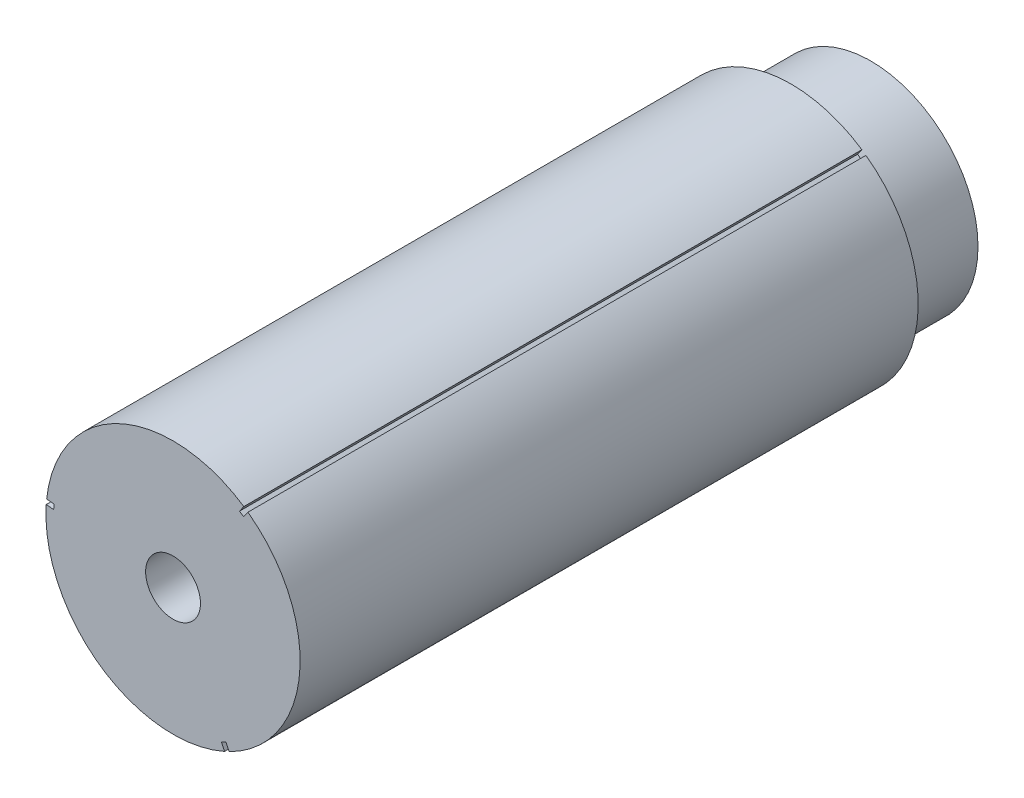
ISO-10303-21;
HEADER;
FILE_DESCRIPTION(('STEP AP214'),'2;1');
FILE_NAME('part.step','',(''),(''),'','','');
FILE_SCHEMA(('AUTOMOTIVE_DESIGN { 1 0 10303 214 1 1 1 1 }'));
ENDSEC;
DATA;
#1=APPLICATION_CONTEXT('core data for automotive mechanical design processes');
#2=APPLICATION_PROTOCOL_DEFINITION('international standard','automotive_design',2000,#1);
#3=PRODUCT_CONTEXT('',#1,'mechanical');
#4=PRODUCT('Part','Part','',(#3));
#5=PRODUCT_RELATED_PRODUCT_CATEGORY('part','',(#4));
#6=PRODUCT_DEFINITION_FORMATION('','',#4);
#7=PRODUCT_DEFINITION_CONTEXT('part definition',#1,'design');
#8=PRODUCT_DEFINITION('design','',#6,#7);
#9=PRODUCT_DEFINITION_SHAPE('','',#8);
#10=(LENGTH_UNIT() NAMED_UNIT(*) SI_UNIT(.MILLI.,.METRE.));
#11=(NAMED_UNIT(*) PLANE_ANGLE_UNIT() SI_UNIT($,.RADIAN.));
#12=(NAMED_UNIT(*) SI_UNIT($,.STERADIAN.) SOLID_ANGLE_UNIT());
#13=UNCERTAINTY_MEASURE_WITH_UNIT(LENGTH_MEASURE(1.E-05),#10,'distance_accuracy_value','');
#14=(GEOMETRIC_REPRESENTATION_CONTEXT(3) GLOBAL_UNCERTAINTY_ASSIGNED_CONTEXT((#13)) GLOBAL_UNIT_ASSIGNED_CONTEXT((#10,
#11,#12)) REPRESENTATION_CONTEXT('',''));
#15=CARTESIAN_POINT('',(0.,0.,0.));
#16=DIRECTION('',(0.,0.,1.));
#17=DIRECTION('',(1.,0.,0.));
#18=AXIS2_PLACEMENT_3D('',#15,#16,#17);
#19=CARTESIAN_POINT('',(0.,0.,70.));
#20=DIRECTION('',(0.,0.,-1.));
#21=DIRECTION('',(-1.,0.,0.));
#22=AXIS2_PLACEMENT_3D('',#19,#20,#21);
#23=CYLINDRICAL_SURFACE('',#22,12.75);
#24=CARTESIAN_POINT('',(0.,0.,8.));
#25=DIRECTION('',(0.,0.,1.));
#26=DIRECTION('',(1.,0.,0.));
#27=AXIS2_PLACEMENT_3D('',#24,#25,#26);
#28=CIRCLE('',#27,12.75);
#29=CARTESIAN_POINT('',(7.10084197030709,10.5896432098879,8.));
#30=VERTEX_POINT('',#29);
#31=CARTESIAN_POINT('',(-12.6780284226737,1.35281015441083,8.));
#32=VERTEX_POINT('',#31);
#33=EDGE_CURVE('E147',#30,#32,#28,.T.);
#34=ORIENTED_EDGE('',*,*,#33,.T.);
#35=DIRECTION('',(0.,0.,-1.));
#36=VECTOR('',#35,1.);
#37=CARTESIAN_POINT('',(-12.6780284226737,1.35281015441083,70.));
#38=LINE('',#37,#36);
#39=CARTESIAN_POINT('',(-12.6780284226737,1.35281015441083,70.));
#40=VERTEX_POINT('',#39);
#41=EDGE_CURVE('E131',#40,#32,#38,.T.);
#42=ORIENTED_EDGE('',*,*,#41,.F.);
#43=CARTESIAN_POINT('',(0.,0.,70.));
#44=DIRECTION('',(0.,0.,1.));
#45=DIRECTION('',(1.,0.,0.));
#46=AXIS2_PLACEMENT_3D('',#43,#44,#45);
#47=CIRCLE('',#46,12.75);
#48=CARTESIAN_POINT('',(7.10084197030709,10.5896432098879,70.));
#49=VERTEX_POINT('',#48);
#50=EDGE_CURVE('E145',#49,#40,#47,.T.);
#51=ORIENTED_EDGE('',*,*,#50,.F.);
#52=DIRECTION('',(0.,0.,-1.));
#53=VECTOR('',#52,1.);
#54=CARTESIAN_POINT('',(7.10084197030709,10.5896432098879,70.));
#55=LINE('',#54,#53);
#56=EDGE_CURVE('E199',#30,#49,#55,.F.);
#57=ORIENTED_EDGE('',*,*,#56,.F.);
#58=EDGE_LOOP('',(#34,#42,#51,#57));
#59=FACE_BOUND('',#58,.T.);
#60=ADVANCED_FACE('F38',(#59),#23,.T.);
#61=CARTESIAN_POINT('',(-12.7213210219299,0.854687929600842,70.));
#62=VERTEX_POINT('',#61);
#63=CARTESIAN_POINT('',(5.16744625111959,-11.655899761142,70.));
#64=VERTEX_POINT('',#63);
#65=EDGE_CURVE('E157',#62,#64,#47,.T.);
#66=ORIENTED_EDGE('',*,*,#65,.F.);
#67=DIRECTION('',(0.,0.,-1.));
#68=VECTOR('',#67,1.);
#69=CARTESIAN_POINT('',(-12.7213210219299,0.854687929600842,70.));
#70=LINE('',#69,#68);
#71=CARTESIAN_POINT('',(-12.7213210219299,0.854687929600842,8.));
#72=VERTEX_POINT('',#71);
#73=EDGE_CURVE('E53',#72,#62,#70,.F.);
#74=ORIENTED_EDGE('',*,*,#73,.F.);
#75=CARTESIAN_POINT('',(5.16744625111959,-11.655899761142,8.));
#76=VERTEX_POINT('',#75);
#77=EDGE_CURVE('E168',#72,#76,#28,.T.);
#78=ORIENTED_EDGE('',*,*,#77,.T.);
#79=DIRECTION('',(0.,0.,-1.));
#80=VECTOR('',#79,1.);
#81=CARTESIAN_POINT('',(5.16744625111959,-11.655899761142,70.));
#82=LINE('',#81,#80);
#83=EDGE_CURVE('E221',#64,#76,#82,.T.);
#84=ORIENTED_EDGE('',*,*,#83,.F.);
#85=EDGE_LOOP('',(#66,#74,#78,#84));
#86=FACE_BOUND('',#85,.T.);
#87=ADVANCED_FACE('F249',(#86),#23,.T.);
#88=CARTESIAN_POINT('',(0.,0.,0.));
#89=DIRECTION('',(0.,0.,1.));
#90=DIRECTION('',(1.,0.,0.));
#91=AXIS2_PLACEMENT_3D('',#88,#89,#90);
#92=PLANE('',#91);
#93=CARTESIAN_POINT('',(0.,0.,0.));
#94=DIRECTION('',(0.,0.,1.));
#95=DIRECTION('',(1.,0.,0.));
#96=AXIS2_PLACEMENT_3D('',#93,#94,#95);
#97=CIRCLE('',#96,10.75);
#98=CARTESIAN_POINT('',(10.75,0.,0.));
#99=VERTEX_POINT('',#98);
#100=EDGE_CURVE('E42',#99,#99,#97,.T.);
#101=ORIENTED_EDGE('',*,*,#100,.F.);
#102=EDGE_LOOP('',(#101));
#103=FACE_BOUND('',#102,.T.);
#104=CARTESIAN_POINT('',(0.,0.,0.));
#105=DIRECTION('',(0.,0.,1.));
#106=DIRECTION('',(1.,0.,0.));
#107=AXIS2_PLACEMENT_3D('',#104,#105,#106);
#108=CIRCLE('',#107,2.75);
#109=CARTESIAN_POINT('',(2.75,0.,0.));
#110=VERTEX_POINT('',#109);
#111=EDGE_CURVE('E156',#110,#110,#108,.T.);
#112=ORIENTED_EDGE('',*,*,#111,.T.);
#113=EDGE_LOOP('',(#112));
#114=FACE_BOUND('',#113,.T.);
#115=ADVANCED_FACE('F282',(#103,#114),#92,.F.);
#116=CARTESIAN_POINT('',(0.,0.,8.));
#117=DIRECTION('',(0.,0.,-1.));
#118=DIRECTION('',(-1.,0.,0.));
#119=AXIS2_PLACEMENT_3D('',#116,#117,#118);
#120=CYLINDRICAL_SURFACE('',#119,10.75);
#121=CARTESIAN_POINT('',(0.,0.,8.));
#122=DIRECTION('',(0.,0.,1.));
#123=DIRECTION('',(1.,0.,0.));
#124=AXIS2_PLACEMENT_3D('',#121,#122,#123);
#125=CIRCLE('',#124,10.75);
#126=CARTESIAN_POINT('',(10.75,0.,8.));
#127=VERTEX_POINT('',#126);
#128=EDGE_CURVE('E11',#127,#127,#125,.T.);
#129=ORIENTED_EDGE('',*,*,#128,.F.);
#130=EDGE_LOOP('',(#129));
#131=FACE_BOUND('',#130,.T.);
#132=ORIENTED_EDGE('',*,*,#100,.T.);
#133=EDGE_LOOP('',(#132));
#134=FACE_BOUND('',#133,.T.);
#135=ADVANCED_FACE('F40',(#131,#134),#120,.T.);
#136=CARTESIAN_POINT('',(0.,0.,8.));
#137=DIRECTION('',(0.,0.,-1.));
#138=DIRECTION('',(-1.,0.,0.));
#139=AXIS2_PLACEMENT_3D('',#136,#137,#138);
#140=CYLINDRICAL_SURFACE('',#139,2.75);
#141=ORIENTED_EDGE('',*,*,#111,.F.);
#142=EDGE_LOOP('',(#141));
#143=FACE_BOUND('',#142,.T.);
#144=CARTESIAN_POINT('',(0.,0.,70.));
#145=DIRECTION('',(0.,0.,1.));
#146=DIRECTION('',(1.,0.,0.));
#147=AXIS2_PLACEMENT_3D('',#144,#145,#146);
#148=CIRCLE('',#147,2.75);
#149=CARTESIAN_POINT('',(2.75,0.,70.));
#150=VERTEX_POINT('',#149);
#151=EDGE_CURVE('E170',#150,#150,#148,.T.);
#152=ORIENTED_EDGE('',*,*,#151,.T.);
#153=EDGE_LOOP('',(#152));
#154=FACE_BOUND('',#153,.T.);
#155=ADVANCED_FACE('F294',(#143,#154),#140,.F.);
#156=CARTESIAN_POINT('',(0.,0.,8.));
#157=DIRECTION('',(0.,0.,1.));
#158=DIRECTION('',(1.,0.,0.));
#159=AXIS2_PLACEMENT_3D('',#156,#157,#158);
#160=PLANE('',#159);
#161=DIRECTION('',(-0.0865851985122626,-0.996244449619968,0.));
#162=VECTOR('',#161,1.);
#163=CARTESIAN_POINT('',(-11.9765796950677,0.789961269742166,8.));
#164=LINE('',#163,#162);
#165=CARTESIAN_POINT('',(-11.9332870958115,1.28808349455215,8.));
#166=VERTEX_POINT('',#165);
#167=CARTESIAN_POINT('',(-11.9765796950677,0.789961269742166,8.));
#168=VERTEX_POINT('',#167);
#169=EDGE_CURVE('E148',#166,#168,#164,.T.);
#170=ORIENTED_EDGE('',*,*,#169,.F.);
#171=DIRECTION('',(0.996244449619968,-0.0865851985122626,0.));
#172=VECTOR('',#171,1.);
#173=CARTESIAN_POINT('',(-11.9332870958115,1.28808349455215,8.));
#174=LINE('',#173,#172);
#175=EDGE_CURVE('E233',#32,#166,#174,.T.);
#176=ORIENTED_EDGE('',*,*,#175,.F.);
#177=ORIENTED_EDGE('',*,*,#33,.F.);
#178=DIRECTION('',(0.573107206313315,0.819480402494012,0.));
#179=VECTOR('',#178,1.);
#180=CARTESIAN_POINT('',(7.15816362538627,10.6716068851976,8.));
#181=LINE('',#180,#179);
#182=CARTESIAN_POINT('',(6.67241637513627,9.97704163150647,8.));
#183=VERTEX_POINT('',#182);
#184=EDGE_CURVE('E176',#183,#30,#181,.T.);
#185=ORIENTED_EDGE('',*,*,#184,.F.);
#186=DIRECTION('',(-0.819480402494012,0.573107206313315,0.));
#187=VECTOR('',#186,1.);
#188=CARTESIAN_POINT('',(6.67241637513627,9.97704163150647,8.));
#189=LINE('',#188,#187);
#190=CARTESIAN_POINT('',(7.08215657638328,9.69048802834981,8.));
#191=VERTEX_POINT('',#190);
#192=EDGE_CURVE('E194',#191,#183,#189,.T.);
#193=ORIENTED_EDGE('',*,*,#192,.F.);
#194=DIRECTION('',(-0.573107206313314,-0.819480402494012,0.));
#195=VECTOR('',#194,1.);
#196=CARTESIAN_POINT('',(7.08215657638328,9.69048802834981,8.));
#197=LINE('',#196,#195);
#198=CARTESIAN_POINT('',(7.51058217155409,10.3030896067313,8.));
#199=VERTEX_POINT('',#198);
#200=EDGE_CURVE('E191',#199,#191,#197,.T.);
#201=ORIENTED_EDGE('',*,*,#200,.F.);
#202=CARTESIAN_POINT('',(5.62047905162273,-11.4443311394887,8.));
#203=VERTEX_POINT('',#202);
#204=EDGE_CURVE('E169',#203,#199,#28,.T.);
#205=ORIENTED_EDGE('',*,*,#204,.F.);
#206=DIRECTION('',(0.423137243306647,-0.906065601006269,0.));
#207=VECTOR('',#206,1.);
#208=CARTESIAN_POINT('',(5.66280084908886,-11.5349549866291,8.));
#209=LINE('',#208,#207);
#210=CARTESIAN_POINT('',(5.30416331993136,-10.7670029012485,8.));
#211=VERTEX_POINT('',#210);
#212=EDGE_CURVE('E61',#211,#203,#209,.T.);
#213=ORIENTED_EDGE('',*,*,#212,.F.);
#214=DIRECTION('',(0.906065601006266,0.423137243306652,0.));
#215=VECTOR('',#214,1.);
#216=CARTESIAN_POINT('',(5.30416331993136,-10.7670029012485,8.));
#217=LINE('',#216,#215);
#218=CARTESIAN_POINT('',(4.85113051942823,-10.9785715229019,8.));
#219=VERTEX_POINT('',#218);
#220=EDGE_CURVE('E218',#219,#211,#217,.T.);
#221=ORIENTED_EDGE('',*,*,#220,.F.);
#222=DIRECTION('',(-0.423137243306646,0.90606560100627,0.));
#223=VECTOR('',#222,1.);
#224=CARTESIAN_POINT('',(4.85113051942823,-10.9785715229019,8.));
#225=LINE('',#224,#223);
#226=EDGE_CURVE('E215',#76,#219,#225,.T.);
#227=ORIENTED_EDGE('',*,*,#226,.F.);
#228=ORIENTED_EDGE('',*,*,#77,.F.);
#229=DIRECTION('',(-0.996244449619968,0.0865851985122583,0.));
#230=VECTOR('',#229,1.);
#231=CARTESIAN_POINT('',(-12.8209644744752,0.863348101431535,8.));
#232=LINE('',#231,#230);
#233=EDGE_CURVE('E226',#168,#72,#232,.T.);
#234=ORIENTED_EDGE('',*,*,#233,.F.);
#235=EDGE_LOOP('',(#170,#176,#177,#185,#193,#201,#205,#213,#221,#227,#228,#234));
#236=FACE_BOUND('',#235,.T.);
#237=ORIENTED_EDGE('',*,*,#128,.T.);
#238=EDGE_LOOP('',(#237));
#239=FACE_BOUND('',#238,.T.);
#240=ADVANCED_FACE('F243',(#236,#239),#160,.F.);
#241=CARTESIAN_POINT('',(0.,0.,70.));
#242=DIRECTION('',(0.,0.,1.));
#243=DIRECTION('',(1.,0.,0.));
#244=AXIS2_PLACEMENT_3D('',#241,#242,#243);
#245=PLANE('',#244);
#246=DIRECTION('',(-0.996244449619967,0.0865851985122626,0.));
#247=VECTOR('',#246,1.);
#248=CARTESIAN_POINT('',(-11.9332870958115,1.28808349455215,70.));
#249=LINE('',#248,#247);
#250=CARTESIAN_POINT('',(-11.9332870958115,1.28808349455215,70.));
#251=VERTEX_POINT('',#250);
#252=EDGE_CURVE('E127',#251,#40,#249,.T.);
#253=ORIENTED_EDGE('',*,*,#252,.F.);
#254=DIRECTION('',(0.0865851985122626,0.996244449619968,0.));
#255=VECTOR('',#254,1.);
#256=CARTESIAN_POINT('',(-11.9765796950677,0.789961269742166,70.));
#257=LINE('',#256,#255);
#258=CARTESIAN_POINT('',(-11.9765796950677,0.789961269742166,70.));
#259=VERTEX_POINT('',#258);
#260=EDGE_CURVE('E139',#259,#251,#257,.T.);
#261=ORIENTED_EDGE('',*,*,#260,.F.);
#262=DIRECTION('',(0.996244449619968,-0.0865851985122583,0.));
#263=VECTOR('',#262,1.);
#264=CARTESIAN_POINT('',(-12.8209644744752,0.863348101431535,70.));
#265=LINE('',#264,#263);
#266=EDGE_CURVE('E231',#62,#259,#265,.T.);
#267=ORIENTED_EDGE('',*,*,#266,.F.);
#268=ORIENTED_EDGE('',*,*,#65,.T.);
#269=DIRECTION('',(0.423137243306646,-0.906065601006269,0.));
#270=VECTOR('',#269,1.);
#271=CARTESIAN_POINT('',(4.85113051942823,-10.9785715229019,70.));
#272=LINE('',#271,#270);
#273=CARTESIAN_POINT('',(4.85113051942823,-10.9785715229019,70.));
#274=VERTEX_POINT('',#273);
#275=EDGE_CURVE('E205',#274,#64,#272,.T.);
#276=ORIENTED_EDGE('',*,*,#275,.F.);
#277=DIRECTION('',(-0.906065601006267,-0.423137243306652,0.));
#278=VECTOR('',#277,1.);
#279=CARTESIAN_POINT('',(5.30416331993136,-10.7670029012485,70.));
#280=LINE('',#279,#278);
#281=CARTESIAN_POINT('',(5.30416331993136,-10.7670029012485,70.));
#282=VERTEX_POINT('',#281);
#283=EDGE_CURVE('E209',#282,#274,#280,.T.);
#284=ORIENTED_EDGE('',*,*,#283,.F.);
#285=DIRECTION('',(-0.423137243306647,0.906065601006269,0.));
#286=VECTOR('',#285,1.);
#287=CARTESIAN_POINT('',(5.66280084908886,-11.5349549866291,70.));
#288=LINE('',#287,#286);
#289=CARTESIAN_POINT('',(5.62047905162272,-11.4443311394887,70.));
#290=VERTEX_POINT('',#289);
#291=EDGE_CURVE('E212',#290,#282,#288,.T.);
#292=ORIENTED_EDGE('',*,*,#291,.F.);
#293=CARTESIAN_POINT('',(7.51058217155409,10.3030896067313,70.));
#294=VERTEX_POINT('',#293);
#295=EDGE_CURVE('E159',#290,#294,#47,.T.);
#296=ORIENTED_EDGE('',*,*,#295,.T.);
#297=DIRECTION('',(0.573107206313314,0.819480402494012,0.));
#298=VECTOR('',#297,1.);
#299=CARTESIAN_POINT('',(7.08215657638328,9.69048802834981,70.));
#300=LINE('',#299,#298);
#301=CARTESIAN_POINT('',(7.08215657638328,9.69048802834981,70.));
#302=VERTEX_POINT('',#301);
#303=EDGE_CURVE('E184',#302,#294,#300,.T.);
#304=ORIENTED_EDGE('',*,*,#303,.F.);
#305=DIRECTION('',(0.819480402494012,-0.573107206313315,0.));
#306=VECTOR('',#305,1.);
#307=CARTESIAN_POINT('',(6.67241637513627,9.97704163150647,70.));
#308=LINE('',#307,#306);
#309=CARTESIAN_POINT('',(6.67241637513627,9.97704163150647,70.));
#310=VERTEX_POINT('',#309);
#311=EDGE_CURVE('E187',#310,#302,#308,.T.);
#312=ORIENTED_EDGE('',*,*,#311,.F.);
#313=DIRECTION('',(-0.573107206313315,-0.819480402494012,0.));
#314=VECTOR('',#313,1.);
#315=CARTESIAN_POINT('',(7.15816362538627,10.6716068851976,70.));
#316=LINE('',#315,#314);
#317=EDGE_CURVE('E155',#49,#310,#316,.T.);
#318=ORIENTED_EDGE('',*,*,#317,.F.);
#319=ORIENTED_EDGE('',*,*,#50,.T.);
#320=EDGE_LOOP('',(#253,#261,#267,#268,#276,#284,#292,#296,#304,#312,#318,#319));
#321=FACE_BOUND('',#320,.T.);
#322=ORIENTED_EDGE('',*,*,#151,.F.);
#323=EDGE_LOOP('',(#322));
#324=FACE_BOUND('',#323,.T.);
#325=ADVANCED_FACE('F151',(#321,#324),#245,.T.);
#326=ORIENTED_EDGE('',*,*,#295,.F.);
#327=DIRECTION('',(0.,0.,-1.));
#328=VECTOR('',#327,1.);
#329=CARTESIAN_POINT('',(5.62047905162273,-11.4443311394887,70.));
#330=LINE('',#329,#328);
#331=EDGE_CURVE('E224',#203,#290,#330,.F.);
#332=ORIENTED_EDGE('',*,*,#331,.F.);
#333=ORIENTED_EDGE('',*,*,#204,.T.);
#334=DIRECTION('',(0.,0.,-1.));
#335=VECTOR('',#334,1.);
#336=CARTESIAN_POINT('',(7.51058217155409,10.3030896067313,70.));
#337=LINE('',#336,#335);
#338=EDGE_CURVE('E197',#294,#199,#337,.T.);
#339=ORIENTED_EDGE('',*,*,#338,.F.);
#340=EDGE_LOOP('',(#326,#332,#333,#339));
#341=FACE_BOUND('',#340,.T.);
#342=ADVANCED_FACE('F258',(#341),#23,.T.);
#343=CARTESIAN_POINT('',(7.08215657638328,9.69048802834981,-0.001000000000001));
#344=DIRECTION('',(0.819480402494012,-0.573107206313314,0.));
#345=DIRECTION('',(0.573107206313314,0.819480402494012,0.));
#346=AXIS2_PLACEMENT_3D('',#343,#344,#345);
#347=PLANE('',#346);
#348=ORIENTED_EDGE('',*,*,#200,.T.);
#349=DIRECTION('',(0.,0.,1.));
#350=VECTOR('',#349,1.);
#351=CARTESIAN_POINT('',(7.08215657638328,9.69048802834981,-0.001000000000001));
#352=LINE('',#351,#350);
#353=EDGE_CURVE('E179',#191,#302,#352,.T.);
#354=ORIENTED_EDGE('',*,*,#353,.T.);
#355=ORIENTED_EDGE('',*,*,#303,.T.);
#356=ORIENTED_EDGE('',*,*,#338,.T.);
#357=EDGE_LOOP('',(#348,#354,#355,#356));
#358=FACE_BOUND('',#357,.T.);
#359=ADVANCED_FACE('F261',(#358),#347,.F.);
#360=CARTESIAN_POINT('',(6.67241637513627,9.97704163150647,-0.001000000000001));
#361=DIRECTION('',(-0.573107206313315,-0.819480402494012,0.));
#362=DIRECTION('',(0.819480402494012,-0.573107206313315,0.));
#363=AXIS2_PLACEMENT_3D('',#360,#361,#362);
#364=PLANE('',#363);
#365=ORIENTED_EDGE('',*,*,#192,.T.);
#366=DIRECTION('',(0.,0.,1.));
#367=VECTOR('',#366,1.);
#368=CARTESIAN_POINT('',(6.67241637513627,9.97704163150647,-0.001000000000001));
#369=LINE('',#368,#367);
#370=EDGE_CURVE('E182',#183,#310,#369,.T.);
#371=ORIENTED_EDGE('',*,*,#370,.T.);
#372=ORIENTED_EDGE('',*,*,#311,.T.);
#373=ORIENTED_EDGE('',*,*,#353,.F.);
#374=EDGE_LOOP('',(#365,#371,#372,#373));
#375=FACE_BOUND('',#374,.T.);
#376=ADVANCED_FACE('F265',(#375),#364,.F.);
#377=CARTESIAN_POINT('',(7.15816362538627,10.6716068851976,-0.001000000000001));
#378=DIRECTION('',(-0.819480402494012,0.573107206313315,0.));
#379=DIRECTION('',(-0.573107206313315,-0.819480402494012,0.));
#380=AXIS2_PLACEMENT_3D('',#377,#378,#379);
#381=PLANE('',#380);
#382=ORIENTED_EDGE('',*,*,#184,.T.);
#383=ORIENTED_EDGE('',*,*,#56,.T.);
#384=ORIENTED_EDGE('',*,*,#317,.T.);
#385=ORIENTED_EDGE('',*,*,#370,.F.);
#386=EDGE_LOOP('',(#382,#383,#384,#385));
#387=FACE_BOUND('',#386,.T.);
#388=ADVANCED_FACE('F267',(#387),#381,.F.);
#389=CARTESIAN_POINT('',(4.85113051942823,-10.9785715229019,-0.001000000000001));
#390=DIRECTION('',(-0.906065601006269,-0.423137243306646,0.));
#391=DIRECTION('',(0.423137243306646,-0.90606560100627,0.));
#392=AXIS2_PLACEMENT_3D('',#389,#390,#391);
#393=PLANE('',#392);
#394=ORIENTED_EDGE('',*,*,#226,.T.);
#395=DIRECTION('',(0.,0.,1.));
#396=VECTOR('',#395,1.);
#397=CARTESIAN_POINT('',(4.85113051942823,-10.9785715229019,-0.001000000000001));
#398=LINE('',#397,#396);
#399=EDGE_CURVE('E202',#219,#274,#398,.T.);
#400=ORIENTED_EDGE('',*,*,#399,.T.);
#401=ORIENTED_EDGE('',*,*,#275,.T.);
#402=ORIENTED_EDGE('',*,*,#83,.T.);
#403=EDGE_LOOP('',(#394,#400,#401,#402));
#404=FACE_BOUND('',#403,.T.);
#405=ADVANCED_FACE('F254',(#404),#393,.F.);
#406=CARTESIAN_POINT('',(5.30416331993136,-10.7670029012485,-0.001000000000001));
#407=DIRECTION('',(-0.423137243306652,0.906065601006267,0.));
#408=DIRECTION('',(-0.906065601006266,-0.423137243306652,0.));
#409=AXIS2_PLACEMENT_3D('',#406,#407,#408);
#410=PLANE('',#409);
#411=ORIENTED_EDGE('',*,*,#220,.T.);
#412=DIRECTION('',(0.,0.,1.));
#413=VECTOR('',#412,1.);
#414=CARTESIAN_POINT('',(5.30416331993136,-10.7670029012485,-0.001000000000001));
#415=LINE('',#414,#413);
#416=EDGE_CURVE('E203',#211,#282,#415,.T.);
#417=ORIENTED_EDGE('',*,*,#416,.T.);
#418=ORIENTED_EDGE('',*,*,#283,.T.);
#419=ORIENTED_EDGE('',*,*,#399,.F.);
#420=EDGE_LOOP('',(#411,#417,#418,#419));
#421=FACE_BOUND('',#420,.T.);
#422=ADVANCED_FACE('F257',(#421),#410,.F.);
#423=CARTESIAN_POINT('',(5.66280084908886,-11.5349549866291,-0.001000000000001));
#424=DIRECTION('',(0.906065601006269,0.423137243306647,0.));
#425=DIRECTION('',(-0.423137243306647,0.906065601006269,0.));
#426=AXIS2_PLACEMENT_3D('',#423,#424,#425);
#427=PLANE('',#426);
#428=ORIENTED_EDGE('',*,*,#212,.T.);
#429=ORIENTED_EDGE('',*,*,#331,.T.);
#430=ORIENTED_EDGE('',*,*,#291,.T.);
#431=ORIENTED_EDGE('',*,*,#416,.F.);
#432=EDGE_LOOP('',(#428,#429,#430,#431));
#433=FACE_BOUND('',#432,.T.);
#434=ADVANCED_FACE('F380',(#433),#427,.F.);
#435=CARTESIAN_POINT('',(-11.9332870958115,1.28808349455215,-0.001000000000001));
#436=DIRECTION('',(0.0865851985122626,0.996244449619968,0.));
#437=DIRECTION('',(-0.996244449619968,0.0865851985122626,0.));
#438=AXIS2_PLACEMENT_3D('',#435,#436,#437);
#439=PLANE('',#438);
#440=ORIENTED_EDGE('',*,*,#175,.T.);
#441=DIRECTION('',(0.,0.,1.));
#442=VECTOR('',#441,1.);
#443=CARTESIAN_POINT('',(-11.9332870958115,1.28808349455215,-0.001000000000001));
#444=LINE('',#443,#442);
#445=EDGE_CURVE('E133',#166,#251,#444,.T.);
#446=ORIENTED_EDGE('',*,*,#445,.T.);
#447=ORIENTED_EDGE('',*,*,#252,.T.);
#448=ORIENTED_EDGE('',*,*,#41,.T.);
#449=EDGE_LOOP('',(#440,#446,#447,#448));
#450=FACE_BOUND('',#449,.T.);
#451=ADVANCED_FACE('F130',(#450),#439,.F.);
#452=CARTESIAN_POINT('',(-11.9765796950677,0.789961269742166,-0.001000000000001));
#453=DIRECTION('',(0.996244449619968,-0.0865851985122626,0.));
#454=DIRECTION('',(0.0865851985122626,0.996244449619968,0.));
#455=AXIS2_PLACEMENT_3D('',#452,#453,#454);
#456=PLANE('',#455);
#457=ORIENTED_EDGE('',*,*,#169,.T.);
#458=DIRECTION('',(0.,0.,1.));
#459=VECTOR('',#458,1.);
#460=CARTESIAN_POINT('',(-11.9765796950677,0.789961269742166,-0.001000000000001));
#461=LINE('',#460,#459);
#462=EDGE_CURVE('E138',#168,#259,#461,.T.);
#463=ORIENTED_EDGE('',*,*,#462,.T.);
#464=ORIENTED_EDGE('',*,*,#260,.T.);
#465=ORIENTED_EDGE('',*,*,#445,.F.);
#466=EDGE_LOOP('',(#457,#463,#464,#465));
#467=FACE_BOUND('',#466,.T.);
#468=ADVANCED_FACE('F240',(#467),#456,.F.);
#469=CARTESIAN_POINT('',(-12.8209644744752,0.863348101431535,-0.001000000000001));
#470=DIRECTION('',(-0.0865851985122583,-0.996244449619968,0.));
#471=DIRECTION('',(0.996244449619968,-0.0865851985122583,0.));
#472=AXIS2_PLACEMENT_3D('',#469,#470,#471);
#473=PLANE('',#472);
#474=ORIENTED_EDGE('',*,*,#233,.T.);
#475=ORIENTED_EDGE('',*,*,#73,.T.);
#476=ORIENTED_EDGE('',*,*,#266,.T.);
#477=ORIENTED_EDGE('',*,*,#462,.F.);
#478=EDGE_LOOP('',(#474,#475,#476,#477));
#479=FACE_BOUND('',#478,.T.);
#480=ADVANCED_FACE('F246',(#479),#473,.F.);
#481=CLOSED_SHELL('',(#60,#87,#115,#135,#155,#240,#325,#342,#359,#376,#388,#405,#422,#434,#451,
#468,#480));
#482=MANIFOLD_SOLID_BREP('B2',#481);
#483=ADVANCED_BREP_SHAPE_REPRESENTATION('',(#18,#482),#14);
#484=SHAPE_DEFINITION_REPRESENTATION(#9,#483);
ENDSEC;
END-ISO-10303-21;
